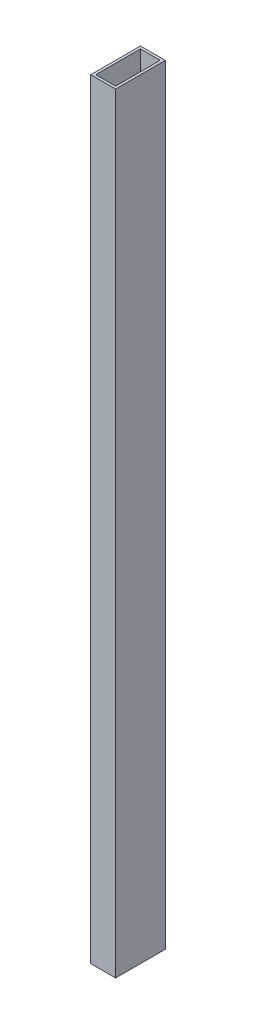
ISO-10303-21;
HEADER;
FILE_DESCRIPTION(('STEP AP214'),'2;1');
FILE_NAME('part.step','',(''),(''),'','','');
FILE_SCHEMA(('AUTOMOTIVE_DESIGN { 1 0 10303 214 1 1 1 1 }'));
ENDSEC;
DATA;
#1=APPLICATION_CONTEXT('core data for automotive mechanical design processes');
#2=APPLICATION_PROTOCOL_DEFINITION('international standard','automotive_design',2000,#1);
#3=PRODUCT_CONTEXT('',#1,'mechanical');
#4=PRODUCT('Part','Part','',(#3));
#5=PRODUCT_RELATED_PRODUCT_CATEGORY('part','',(#4));
#6=PRODUCT_DEFINITION_FORMATION('','',#4);
#7=PRODUCT_DEFINITION_CONTEXT('part definition',#1,'design');
#8=PRODUCT_DEFINITION('design','',#6,#7);
#9=PRODUCT_DEFINITION_SHAPE('','',#8);
#10=(LENGTH_UNIT() NAMED_UNIT(*) SI_UNIT(.MILLI.,.METRE.));
#11=(NAMED_UNIT(*) PLANE_ANGLE_UNIT() SI_UNIT($,.RADIAN.));
#12=(NAMED_UNIT(*) SI_UNIT($,.STERADIAN.) SOLID_ANGLE_UNIT());
#13=UNCERTAINTY_MEASURE_WITH_UNIT(LENGTH_MEASURE(1.E-05),#10,'distance_accuracy_value','');
#14=(GEOMETRIC_REPRESENTATION_CONTEXT(3) GLOBAL_UNCERTAINTY_ASSIGNED_CONTEXT((#13)) GLOBAL_UNIT_ASSIGNED_CONTEXT((#10,
#11,#12)) REPRESENTATION_CONTEXT('',''));
#15=CARTESIAN_POINT('',(0.,0.,0.));
#16=DIRECTION('',(0.,0.,1.));
#17=DIRECTION('',(1.,0.,0.));
#18=AXIS2_PLACEMENT_3D('',#15,#16,#17);
#19=CARTESIAN_POINT('',(0.,620.,0.));
#20=DIRECTION('',(0.,1.,0.));
#21=DIRECTION('',(0.,0.,1.));
#22=AXIS2_PLACEMENT_3D('',#19,#20,#21);
#23=PLANE('',#22);
#24=DIRECTION('',(0.,0.,1.));
#25=VECTOR('',#24,1.);
#26=CARTESIAN_POINT('',(-38.5881657013495,620.,-31.8869126510452));
#27=LINE('',#26,#25);
#28=CARTESIAN_POINT('',(-38.5881657013495,620.,-31.8869126510452));
#29=VERTEX_POINT('',#28);
#30=CARTESIAN_POINT('',(-38.5881657013495,620.,8.11308734895481));
#31=VERTEX_POINT('',#30);
#32=EDGE_CURVE('E134',#29,#31,#27,.T.);
#33=ORIENTED_EDGE('',*,*,#32,.T.);
#34=DIRECTION('',(1.,0.,0.));
#35=VECTOR('',#34,1.);
#36=CARTESIAN_POINT('',(-38.5881657013495,620.,8.11308734895481));
#37=LINE('',#36,#35);
#38=CARTESIAN_POINT('',(-18.5881657013495,620.,8.11308734895481));
#39=VERTEX_POINT('',#38);
#40=EDGE_CURVE('E137',#31,#39,#37,.T.);
#41=ORIENTED_EDGE('',*,*,#40,.T.);
#42=DIRECTION('',(0.,0.,-1.));
#43=VECTOR('',#42,1.);
#44=CARTESIAN_POINT('',(-18.5881657013495,620.,-31.8869126510452));
#45=LINE('',#44,#43);
#46=CARTESIAN_POINT('',(-18.5881657013495,620.,-31.8869126510452));
#47=VERTEX_POINT('',#46);
#48=EDGE_CURVE('E140',#39,#47,#45,.T.);
#49=ORIENTED_EDGE('',*,*,#48,.T.);
#50=DIRECTION('',(-1.,0.,0.));
#51=VECTOR('',#50,1.);
#52=CARTESIAN_POINT('',(-38.5881657013495,620.,-31.8869126510452));
#53=LINE('',#52,#51);
#54=EDGE_CURVE('E142',#47,#29,#53,.T.);
#55=ORIENTED_EDGE('',*,*,#54,.T.);
#56=EDGE_LOOP('',(#33,#41,#49,#55));
#57=FACE_BOUND('',#56,.T.);
#58=DIRECTION('',(1.,0.,0.));
#59=VECTOR('',#58,1.);
#60=CARTESIAN_POINT('',(-36.5881657013495,620.,6.11308734895481));
#61=LINE('',#60,#59);
#62=CARTESIAN_POINT('',(-36.5881657013495,620.,6.11308734895481));
#63=VERTEX_POINT('',#62);
#64=CARTESIAN_POINT('',(-20.5881657013495,620.,6.11308734895481));
#65=VERTEX_POINT('',#64);
#66=EDGE_CURVE('E106',#63,#65,#61,.T.);
#67=ORIENTED_EDGE('',*,*,#66,.F.);
#68=DIRECTION('',(0.,0.,1.));
#69=VECTOR('',#68,1.);
#70=CARTESIAN_POINT('',(-36.5881657013495,620.,-29.8869126510452));
#71=LINE('',#70,#69);
#72=CARTESIAN_POINT('',(-36.5881657013495,620.,-29.8869126510452));
#73=VERTEX_POINT('',#72);
#74=EDGE_CURVE('E98',#73,#63,#71,.T.);
#75=ORIENTED_EDGE('',*,*,#74,.F.);
#76=DIRECTION('',(-1.,0.,0.));
#77=VECTOR('',#76,1.);
#78=CARTESIAN_POINT('',(-36.5881657013495,620.,-29.8869126510452));
#79=LINE('',#78,#77);
#80=CARTESIAN_POINT('',(-20.5881657013495,620.,-29.8869126510452));
#81=VERTEX_POINT('',#80);
#82=EDGE_CURVE('E120',#81,#73,#79,.T.);
#83=ORIENTED_EDGE('',*,*,#82,.F.);
#84=DIRECTION('',(0.,0.,-1.));
#85=VECTOR('',#84,1.);
#86=CARTESIAN_POINT('',(-20.5881657013495,620.,-29.8869126510452));
#87=LINE('',#86,#85);
#88=EDGE_CURVE('E118',#65,#81,#87,.T.);
#89=ORIENTED_EDGE('',*,*,#88,.F.);
#90=EDGE_LOOP('',(#67,#75,#83,#89));
#91=FACE_BOUND('',#90,.T.);
#92=ADVANCED_FACE('F33',(#57,#91),#23,.T.);
#93=CARTESIAN_POINT('',(0.,0.,0.));
#94=DIRECTION('',(0.,1.,0.));
#95=DIRECTION('',(0.,0.,1.));
#96=AXIS2_PLACEMENT_3D('',#93,#94,#95);
#97=PLANE('',#96);
#98=DIRECTION('',(0.,0.,1.));
#99=VECTOR('',#98,1.);
#100=CARTESIAN_POINT('',(-38.5881657013495,0.,-31.8869126510452));
#101=LINE('',#100,#99);
#102=CARTESIAN_POINT('',(-38.5881657013495,0.,-31.8869126510452));
#103=VERTEX_POINT('',#102);
#104=CARTESIAN_POINT('',(-38.5881657013495,0.,8.11308734895481));
#105=VERTEX_POINT('',#104);
#106=EDGE_CURVE('E114',#103,#105,#101,.T.);
#107=ORIENTED_EDGE('',*,*,#106,.F.);
#108=DIRECTION('',(-1.,0.,0.));
#109=VECTOR('',#108,1.);
#110=CARTESIAN_POINT('',(-38.5881657013495,0.,-31.8869126510452));
#111=LINE('',#110,#109);
#112=CARTESIAN_POINT('',(-18.5881657013495,0.,-31.8869126510452));
#113=VERTEX_POINT('',#112);
#114=EDGE_CURVE('E138',#113,#103,#111,.T.);
#115=ORIENTED_EDGE('',*,*,#114,.F.);
#116=DIRECTION('',(0.,0.,-1.));
#117=VECTOR('',#116,1.);
#118=CARTESIAN_POINT('',(-18.5881657013495,0.,-31.8869126510452));
#119=LINE('',#118,#117);
#120=CARTESIAN_POINT('',(-18.5881657013495,0.,8.11308734895481));
#121=VERTEX_POINT('',#120);
#122=EDGE_CURVE('E149',#121,#113,#119,.T.);
#123=ORIENTED_EDGE('',*,*,#122,.F.);
#124=DIRECTION('',(1.,0.,0.));
#125=VECTOR('',#124,1.);
#126=CARTESIAN_POINT('',(-38.5881657013495,0.,8.11308734895481));
#127=LINE('',#126,#125);
#128=EDGE_CURVE('E147',#105,#121,#127,.T.);
#129=ORIENTED_EDGE('',*,*,#128,.F.);
#130=EDGE_LOOP('',(#107,#115,#123,#129));
#131=FACE_BOUND('',#130,.T.);
#132=DIRECTION('',(0.,0.,1.));
#133=VECTOR('',#132,1.);
#134=CARTESIAN_POINT('',(-36.5881657013495,0.,-29.8869126510452));
#135=LINE('',#134,#133);
#136=CARTESIAN_POINT('',(-36.5881657013495,0.,-29.8869126510452));
#137=VERTEX_POINT('',#136);
#138=CARTESIAN_POINT('',(-36.5881657013495,0.,6.11308734895481));
#139=VERTEX_POINT('',#138);
#140=EDGE_CURVE('E56',#137,#139,#135,.T.);
#141=ORIENTED_EDGE('',*,*,#140,.T.);
#142=DIRECTION('',(1.,0.,0.));
#143=VECTOR('',#142,1.);
#144=CARTESIAN_POINT('',(-36.5881657013495,0.,6.11308734895481));
#145=LINE('',#144,#143);
#146=CARTESIAN_POINT('',(-20.5881657013495,0.,6.11308734895481));
#147=VERTEX_POINT('',#146);
#148=EDGE_CURVE('E113',#139,#147,#145,.T.);
#149=ORIENTED_EDGE('',*,*,#148,.T.);
#150=DIRECTION('',(0.,0.,-1.));
#151=VECTOR('',#150,1.);
#152=CARTESIAN_POINT('',(-20.5881657013495,0.,-29.8869126510452));
#153=LINE('',#152,#151);
#154=CARTESIAN_POINT('',(-20.5881657013495,0.,-29.8869126510452));
#155=VERTEX_POINT('',#154);
#156=EDGE_CURVE('E126',#147,#155,#153,.T.);
#157=ORIENTED_EDGE('',*,*,#156,.T.);
#158=DIRECTION('',(-1.,0.,0.));
#159=VECTOR('',#158,1.);
#160=CARTESIAN_POINT('',(-36.5881657013495,0.,-29.8869126510452));
#161=LINE('',#160,#159);
#162=EDGE_CURVE('E107',#155,#137,#161,.T.);
#163=ORIENTED_EDGE('',*,*,#162,.T.);
#164=EDGE_LOOP('',(#141,#149,#157,#163));
#165=FACE_BOUND('',#164,.T.);
#166=ADVANCED_FACE('F167',(#131,#165),#97,.F.);
#167=CARTESIAN_POINT('',(-38.5881657013495,620.,-31.8869126510452));
#168=DIRECTION('',(1.,0.,0.));
#169=DIRECTION('',(0.,0.,-1.));
#170=AXIS2_PLACEMENT_3D('',#167,#168,#169);
#171=PLANE('',#170);
#172=ORIENTED_EDGE('',*,*,#106,.T.);
#173=DIRECTION('',(0.,-1.,0.));
#174=VECTOR('',#173,1.);
#175=CARTESIAN_POINT('',(-38.5881657013495,620.,8.11308734895481));
#176=LINE('',#175,#174);
#177=EDGE_CURVE('E11',#31,#105,#176,.T.);
#178=ORIENTED_EDGE('',*,*,#177,.F.);
#179=ORIENTED_EDGE('',*,*,#32,.F.);
#180=DIRECTION('',(0.,-1.,0.));
#181=VECTOR('',#180,1.);
#182=CARTESIAN_POINT('',(-38.5881657013495,620.,-31.8869126510452));
#183=LINE('',#182,#181);
#184=EDGE_CURVE('E144',#29,#103,#183,.T.);
#185=ORIENTED_EDGE('',*,*,#184,.T.);
#186=EDGE_LOOP('',(#172,#178,#179,#185));
#187=FACE_BOUND('',#186,.T.);
#188=ADVANCED_FACE('F35',(#187),#171,.F.);
#189=CARTESIAN_POINT('',(-38.5881657013495,620.,8.11308734895481));
#190=DIRECTION('',(0.,0.,-1.));
#191=DIRECTION('',(-1.,0.,0.));
#192=AXIS2_PLACEMENT_3D('',#189,#190,#191);
#193=PLANE('',#192);
#194=ORIENTED_EDGE('',*,*,#128,.T.);
#195=DIRECTION('',(0.,-1.,0.));
#196=VECTOR('',#195,1.);
#197=CARTESIAN_POINT('',(-18.5881657013495,620.,8.11308734895481));
#198=LINE('',#197,#196);
#199=EDGE_CURVE('E41',#39,#121,#198,.T.);
#200=ORIENTED_EDGE('',*,*,#199,.F.);
#201=ORIENTED_EDGE('',*,*,#40,.F.);
#202=ORIENTED_EDGE('',*,*,#177,.T.);
#203=EDGE_LOOP('',(#194,#200,#201,#202));
#204=FACE_BOUND('',#203,.T.);
#205=ADVANCED_FACE('F177',(#204),#193,.F.);
#206=CARTESIAN_POINT('',(-18.5881657013495,620.,-31.8869126510452));
#207=DIRECTION('',(-1.,0.,0.));
#208=DIRECTION('',(0.,0.,1.));
#209=AXIS2_PLACEMENT_3D('',#206,#207,#208);
#210=PLANE('',#209);
#211=ORIENTED_EDGE('',*,*,#122,.T.);
#212=DIRECTION('',(0.,-1.,0.));
#213=VECTOR('',#212,1.);
#214=CARTESIAN_POINT('',(-18.5881657013495,620.,-31.8869126510452));
#215=LINE('',#214,#213);
#216=EDGE_CURVE('E154',#47,#113,#215,.T.);
#217=ORIENTED_EDGE('',*,*,#216,.F.);
#218=ORIENTED_EDGE('',*,*,#48,.F.);
#219=ORIENTED_EDGE('',*,*,#199,.T.);
#220=EDGE_LOOP('',(#211,#217,#218,#219));
#221=FACE_BOUND('',#220,.T.);
#222=ADVANCED_FACE('F161',(#221),#210,.F.);
#223=CARTESIAN_POINT('',(-38.5881657013495,620.,-31.8869126510452));
#224=DIRECTION('',(0.,0.,1.));
#225=DIRECTION('',(1.,0.,0.));
#226=AXIS2_PLACEMENT_3D('',#223,#224,#225);
#227=PLANE('',#226);
#228=ORIENTED_EDGE('',*,*,#114,.T.);
#229=ORIENTED_EDGE('',*,*,#184,.F.);
#230=ORIENTED_EDGE('',*,*,#54,.F.);
#231=ORIENTED_EDGE('',*,*,#216,.T.);
#232=EDGE_LOOP('',(#228,#229,#230,#231));
#233=FACE_BOUND('',#232,.T.);
#234=ADVANCED_FACE('F171',(#233),#227,.F.);
#235=CARTESIAN_POINT('',(-36.5881657013495,620.,-29.8869126510452));
#236=DIRECTION('',(1.,0.,0.));
#237=DIRECTION('',(0.,0.,-1.));
#238=AXIS2_PLACEMENT_3D('',#235,#236,#237);
#239=PLANE('',#238);
#240=ORIENTED_EDGE('',*,*,#140,.F.);
#241=DIRECTION('',(0.,-1.,0.));
#242=VECTOR('',#241,1.);
#243=CARTESIAN_POINT('',(-36.5881657013495,620.,-29.8869126510452));
#244=LINE('',#243,#242);
#245=EDGE_CURVE('E102',#73,#137,#244,.T.);
#246=ORIENTED_EDGE('',*,*,#245,.F.);
#247=ORIENTED_EDGE('',*,*,#74,.T.);
#248=DIRECTION('',(0.,-1.,0.));
#249=VECTOR('',#248,1.);
#250=CARTESIAN_POINT('',(-36.5881657013495,620.,6.11308734895481));
#251=LINE('',#250,#249);
#252=EDGE_CURVE('E101',#63,#139,#251,.T.);
#253=ORIENTED_EDGE('',*,*,#252,.T.);
#254=EDGE_LOOP('',(#240,#246,#247,#253));
#255=FACE_BOUND('',#254,.T.);
#256=ADVANCED_FACE('F100',(#255),#239,.T.);
#257=CARTESIAN_POINT('',(-36.5881657013495,620.,6.11308734895481));
#258=DIRECTION('',(0.,0.,-1.));
#259=DIRECTION('',(-1.,0.,0.));
#260=AXIS2_PLACEMENT_3D('',#257,#258,#259);
#261=PLANE('',#260);
#262=ORIENTED_EDGE('',*,*,#148,.F.);
#263=ORIENTED_EDGE('',*,*,#252,.F.);
#264=ORIENTED_EDGE('',*,*,#66,.T.);
#265=DIRECTION('',(0.,-1.,0.));
#266=VECTOR('',#265,1.);
#267=CARTESIAN_POINT('',(-20.5881657013495,620.,6.11308734895481));
#268=LINE('',#267,#266);
#269=EDGE_CURVE('E115',#65,#147,#268,.T.);
#270=ORIENTED_EDGE('',*,*,#269,.T.);
#271=EDGE_LOOP('',(#262,#263,#264,#270));
#272=FACE_BOUND('',#271,.T.);
#273=ADVANCED_FACE('F110',(#272),#261,.T.);
#274=CARTESIAN_POINT('',(-20.5881657013495,620.,-29.8869126510452));
#275=DIRECTION('',(-1.,0.,0.));
#276=DIRECTION('',(0.,0.,1.));
#277=AXIS2_PLACEMENT_3D('',#274,#275,#276);
#278=PLANE('',#277);
#279=ORIENTED_EDGE('',*,*,#156,.F.);
#280=ORIENTED_EDGE('',*,*,#269,.F.);
#281=ORIENTED_EDGE('',*,*,#88,.T.);
#282=DIRECTION('',(0.,-1.,0.));
#283=VECTOR('',#282,1.);
#284=CARTESIAN_POINT('',(-20.5881657013495,620.,-29.8869126510452));
#285=LINE('',#284,#283);
#286=EDGE_CURVE('E48',#81,#155,#285,.T.);
#287=ORIENTED_EDGE('',*,*,#286,.T.);
#288=EDGE_LOOP('',(#279,#280,#281,#287));
#289=FACE_BOUND('',#288,.T.);
#290=ADVANCED_FACE('F200',(#289),#278,.T.);
#291=CARTESIAN_POINT('',(-36.5881657013495,620.,-29.8869126510452));
#292=DIRECTION('',(0.,0.,1.));
#293=DIRECTION('',(1.,0.,0.));
#294=AXIS2_PLACEMENT_3D('',#291,#292,#293);
#295=PLANE('',#294);
#296=ORIENTED_EDGE('',*,*,#162,.F.);
#297=ORIENTED_EDGE('',*,*,#286,.F.);
#298=ORIENTED_EDGE('',*,*,#82,.T.);
#299=ORIENTED_EDGE('',*,*,#245,.T.);
#300=EDGE_LOOP('',(#296,#297,#298,#299));
#301=FACE_BOUND('',#300,.T.);
#302=ADVANCED_FACE('F204',(#301),#295,.T.);
#303=CLOSED_SHELL('',(#92,#166,#188,#205,#222,#234,#256,#273,#290,#302));
#304=MANIFOLD_SOLID_BREP('B2',#303);
#305=ADVANCED_BREP_SHAPE_REPRESENTATION('',(#18,#304),#14);
#306=SHAPE_DEFINITION_REPRESENTATION(#9,#305);
ENDSEC;
END-ISO-10303-21;
